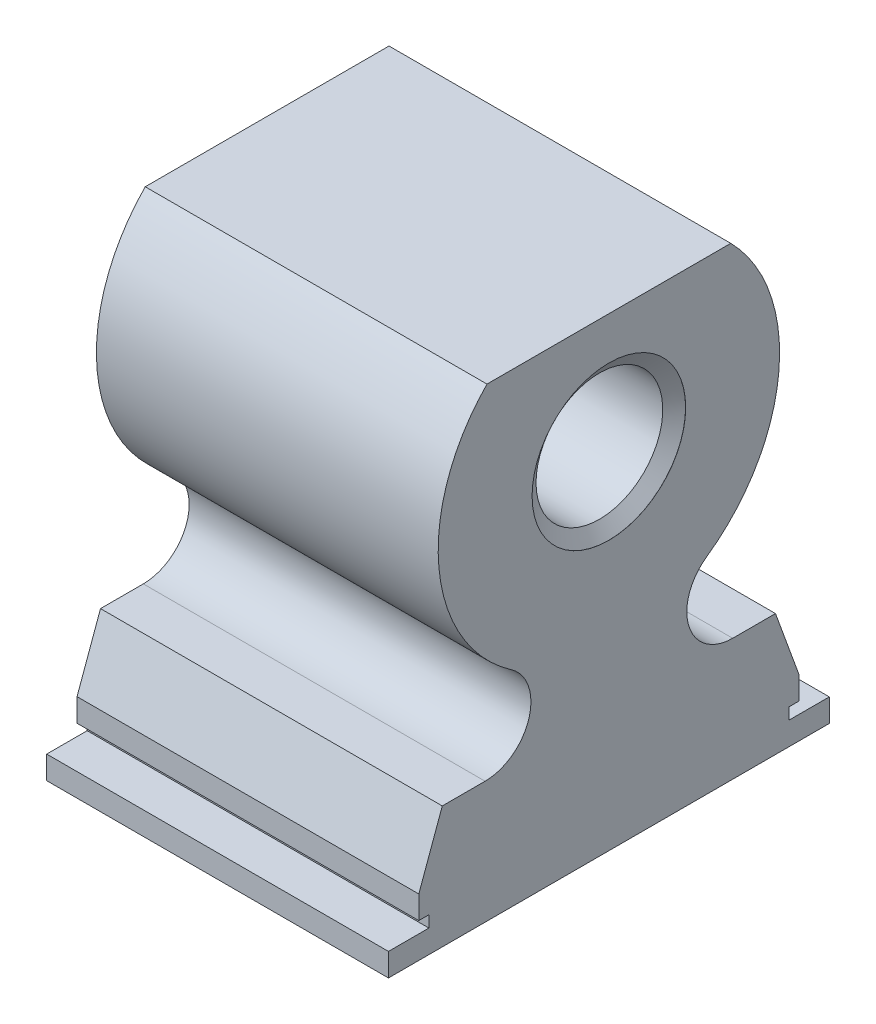
ISO-10303-21;
HEADER;
FILE_DESCRIPTION(('STEP AP214'),'2;1');
FILE_NAME('part.step','',(''),(''),'','','');
FILE_SCHEMA(('AUTOMOTIVE_DESIGN { 1 0 10303 214 1 1 1 1 }'));
ENDSEC;
DATA;
#1=APPLICATION_CONTEXT('core data for automotive mechanical design processes');
#2=APPLICATION_PROTOCOL_DEFINITION('international standard','automotive_design',2000,#1);
#3=PRODUCT_CONTEXT('',#1,'mechanical');
#4=PRODUCT('Part','Part','',(#3));
#5=PRODUCT_RELATED_PRODUCT_CATEGORY('part','',(#4));
#6=PRODUCT_DEFINITION_FORMATION('','',#4);
#7=PRODUCT_DEFINITION_CONTEXT('part definition',#1,'design');
#8=PRODUCT_DEFINITION('design','',#6,#7);
#9=PRODUCT_DEFINITION_SHAPE('','',#8);
#10=(LENGTH_UNIT() NAMED_UNIT(*) SI_UNIT(.MILLI.,.METRE.));
#11=(NAMED_UNIT(*) PLANE_ANGLE_UNIT() SI_UNIT($,.RADIAN.));
#12=(NAMED_UNIT(*) SI_UNIT($,.STERADIAN.) SOLID_ANGLE_UNIT());
#13=UNCERTAINTY_MEASURE_WITH_UNIT(LENGTH_MEASURE(1.E-05),#10,'distance_accuracy_value','');
#14=(GEOMETRIC_REPRESENTATION_CONTEXT(3) GLOBAL_UNCERTAINTY_ASSIGNED_CONTEXT((#13)) GLOBAL_UNIT_ASSIGNED_CONTEXT((#10,
#11,#12)) REPRESENTATION_CONTEXT('',''));
#15=CARTESIAN_POINT('',(0.,0.,0.));
#16=DIRECTION('',(0.,0.,1.));
#17=DIRECTION('',(1.,0.,0.));
#18=AXIS2_PLACEMENT_3D('',#15,#16,#17);
#19=CARTESIAN_POINT('',(8.9,0.,0.));
#20=DIRECTION('',(-1.,0.,0.));
#21=DIRECTION('',(0.,0.,1.));
#22=AXIS2_PLACEMENT_3D('',#19,#20,#21);
#23=CYLINDRICAL_SURFACE('',#22,4.445);
#24=CARTESIAN_POINT('',(8.9,0.,0.));
#25=DIRECTION('',(1.,0.,0.));
#26=DIRECTION('',(0.,0.,-1.));
#27=AXIS2_PLACEMENT_3D('',#24,#25,#26);
#28=CIRCLE('',#27,4.445);
#29=CARTESIAN_POINT('',(8.9,3.1115,3.1743649364873));
#30=VERTEX_POINT('',#29);
#31=CARTESIAN_POINT('',(8.9,-3.64692729897422,2.5412489598614));
#32=VERTEX_POINT('',#31);
#33=EDGE_CURVE('E306',#30,#32,#28,.T.);
#34=ORIENTED_EDGE('',*,*,#33,.F.);
#35=DIRECTION('',(-1.,0.,0.));
#36=VECTOR('',#35,1.);
#37=CARTESIAN_POINT('',(8.9,3.1115,3.1743649364873));
#38=LINE('',#37,#36);
#39=CARTESIAN_POINT('',(0.,3.1115,3.1743649364873));
#40=VERTEX_POINT('',#39);
#41=EDGE_CURVE('E11',#30,#40,#38,.T.);
#42=ORIENTED_EDGE('',*,*,#41,.T.);
#43=CARTESIAN_POINT('',(0.,0.,0.));
#44=DIRECTION('',(1.,0.,0.));
#45=DIRECTION('',(0.,0.,-1.));
#46=AXIS2_PLACEMENT_3D('',#43,#44,#45);
#47=CIRCLE('',#46,4.445);
#48=CARTESIAN_POINT('',(0.,-3.64692729897422,2.5412489598614));
#49=VERTEX_POINT('',#48);
#50=EDGE_CURVE('E225',#40,#49,#47,.T.);
#51=ORIENTED_EDGE('',*,*,#50,.T.);
#52=DIRECTION('',(-1.,0.,0.));
#53=VECTOR('',#52,1.);
#54=CARTESIAN_POINT('',(8.9,-3.64692729897422,2.5412489598614));
#55=LINE('',#54,#53);
#56=EDGE_CURVE('E254',#32,#49,#55,.T.);
#57=ORIENTED_EDGE('',*,*,#56,.F.);
#58=EDGE_LOOP('',(#34,#42,#51,#57));
#59=FACE_BOUND('',#58,.T.);
#60=ADVANCED_FACE('F32',(#59),#23,.T.);
#61=CARTESIAN_POINT('',(8.9,0.,0.));
#62=DIRECTION('',(-1.,0.,0.));
#63=DIRECTION('',(0.,0.,1.));
#64=AXIS2_PLACEMENT_3D('',#61,#62,#63);
#65=CYLINDRICAL_SURFACE('',#64,1.65);
#66=CARTESIAN_POINT('',(0.247521612824611,0.,0.));
#67=DIRECTION('',(-1.,0.,0.));
#68=DIRECTION('',(0.,0.,1.));
#69=AXIS2_PLACEMENT_3D('',#66,#67,#68);
#70=CIRCLE('',#69,1.65);
#71=CARTESIAN_POINT('',(0.247521612824611,0.,1.65));
#72=VERTEX_POINT('',#71);
#73=EDGE_CURVE('E288',#72,#72,#70,.T.);
#74=ORIENTED_EDGE('',*,*,#73,.T.);
#75=EDGE_LOOP('',(#74));
#76=FACE_BOUND('',#75,.T.);
#77=CARTESIAN_POINT('',(8.65247838717539,0.,0.));
#78=DIRECTION('',(-1.,0.,0.));
#79=DIRECTION('',(0.,0.,1.));
#80=AXIS2_PLACEMENT_3D('',#77,#78,#79);
#81=CIRCLE('',#80,1.65);
#82=CARTESIAN_POINT('',(8.65247838717539,0.,1.65));
#83=VERTEX_POINT('',#82);
#84=EDGE_CURVE('E366',#83,#83,#81,.T.);
#85=ORIENTED_EDGE('',*,*,#84,.F.);
#86=EDGE_LOOP('',(#85));
#87=FACE_BOUND('',#86,.T.);
#88=ADVANCED_FACE('F378',(#76,#87),#65,.F.);
#89=CARTESIAN_POINT('',(8.9,-4.62630314643533,3.22369685356467));
#90=DIRECTION('',(-1.,0.,0.));
#91=DIRECTION('',(0.,0.,1.));
#92=AXIS2_PLACEMENT_3D('',#89,#90,#91);
#93=PLANE('',#92);
#94=CARTESIAN_POINT('',(8.9,-3.64692729897422,-2.5412489598614));
#95=VERTEX_POINT('',#94);
#96=CARTESIAN_POINT('',(8.9,3.1115,-3.1743649364873));
#97=VERTEX_POINT('',#96);
#98=EDGE_CURVE('E296',#95,#97,#28,.T.);
#99=ORIENTED_EDGE('',*,*,#98,.T.);
#100=DIRECTION('',(0.,0.,1.));
#101=VECTOR('',#100,1.);
#102=CARTESIAN_POINT('',(8.9,3.1115,-4.445));
#103=LINE('',#102,#101);
#104=EDGE_CURVE('E47',#97,#30,#103,.T.);
#105=ORIENTED_EDGE('',*,*,#104,.T.);
#106=ORIENTED_EDGE('',*,*,#33,.T.);
#107=CARTESIAN_POINT('',(8.9,-4.62630314643533,3.22369685356467));
#108=DIRECTION('',(-1.,0.,0.));
#109=DIRECTION('',(0.,0.,1.));
#110=AXIS2_PLACEMENT_3D('',#107,#108,#109);
#111=CIRCLE('',#110,1.19369685356467);
#112=CARTESIAN_POINT('',(8.9,-5.82,3.22369685356467));
#113=VERTEX_POINT('',#112);
#114=EDGE_CURVE('E305',#32,#113,#111,.T.);
#115=ORIENTED_EDGE('',*,*,#114,.T.);
#116=DIRECTION('',(0.,0.,1.));
#117=VECTOR('',#116,1.);
#118=CARTESIAN_POINT('',(8.9,-5.82,3.22369685356467));
#119=LINE('',#118,#117);
#120=CARTESIAN_POINT('',(8.9,-5.82,4.33853000643278));
#121=VERTEX_POINT('',#120);
#122=EDGE_CURVE('E308',#113,#121,#119,.T.);
#123=ORIENTED_EDGE('',*,*,#122,.T.);
#124=DIRECTION('',(0.,-0.939692620785908,0.342020143325669));
#125=VECTOR('',#124,1.);
#126=CARTESIAN_POINT('',(8.9,-5.82,4.33853000643278));
#127=LINE('',#126,#125);
#128=CARTESIAN_POINT('',(8.9,-7.5,4.95));
#129=VERTEX_POINT('',#128);
#130=EDGE_CURVE('E314',#121,#129,#127,.T.);
#131=ORIENTED_EDGE('',*,*,#130,.T.);
#132=DIRECTION('',(0.,-1.,0.));
#133=VECTOR('',#132,1.);
#134=CARTESIAN_POINT('',(8.9,-7.5,4.95));
#135=LINE('',#134,#133);
#136=CARTESIAN_POINT('',(8.9,-8.1,4.95));
#137=VERTEX_POINT('',#136);
#138=EDGE_CURVE('E182',#129,#137,#135,.T.);
#139=ORIENTED_EDGE('',*,*,#138,.T.);
#140=DIRECTION('',(0.,0.,-1.));
#141=VECTOR('',#140,1.);
#142=CARTESIAN_POINT('',(8.9,-8.1,4.68666666666667));
#143=LINE('',#142,#141);
#144=CARTESIAN_POINT('',(8.9,-8.1,4.68666666666667));
#145=VERTEX_POINT('',#144);
#146=EDGE_CURVE('E173',#137,#145,#143,.T.);
#147=ORIENTED_EDGE('',*,*,#146,.T.);
#148=DIRECTION('',(0.,-1.,0.));
#149=VECTOR('',#148,1.);
#150=CARTESIAN_POINT('',(8.9,-8.4,4.68666666666667));
#151=LINE('',#150,#149);
#152=CARTESIAN_POINT('',(8.9,-8.4,4.68666666666667));
#153=VERTEX_POINT('',#152);
#154=EDGE_CURVE('E179',#145,#153,#151,.T.);
#155=ORIENTED_EDGE('',*,*,#154,.T.);
#156=DIRECTION('',(0.,0.,1.));
#157=VECTOR('',#156,1.);
#158=CARTESIAN_POINT('',(8.9,-8.4,5.74));
#159=LINE('',#158,#157);
#160=CARTESIAN_POINT('',(8.9,-8.4,5.74));
#161=VERTEX_POINT('',#160);
#162=EDGE_CURVE('E56',#153,#161,#159,.T.);
#163=ORIENTED_EDGE('',*,*,#162,.T.);
#164=DIRECTION('',(0.,-1.,0.));
#165=VECTOR('',#164,1.);
#166=CARTESIAN_POINT('',(8.9,-9.,5.74));
#167=LINE('',#166,#165);
#168=CARTESIAN_POINT('',(8.9,-9.,5.74));
#169=VERTEX_POINT('',#168);
#170=EDGE_CURVE('E241',#161,#169,#167,.T.);
#171=ORIENTED_EDGE('',*,*,#170,.T.);
#172=DIRECTION('',(0.,0.,-1.));
#173=VECTOR('',#172,1.);
#174=CARTESIAN_POINT('',(8.9,-9.,5.74));
#175=LINE('',#174,#173);
#176=CARTESIAN_POINT('',(8.9,-9.,-5.74));
#177=VERTEX_POINT('',#176);
#178=EDGE_CURVE('E128',#169,#177,#175,.T.);
#179=ORIENTED_EDGE('',*,*,#178,.T.);
#180=DIRECTION('',(0.,1.,0.));
#181=VECTOR('',#180,1.);
#182=CARTESIAN_POINT('',(8.9,-9.,-5.74));
#183=LINE('',#182,#181);
#184=CARTESIAN_POINT('',(8.9,-8.4,-5.74));
#185=VERTEX_POINT('',#184);
#186=EDGE_CURVE('E334',#177,#185,#183,.T.);
#187=ORIENTED_EDGE('',*,*,#186,.T.);
#188=DIRECTION('',(0.,0.,1.));
#189=VECTOR('',#188,1.);
#190=CARTESIAN_POINT('',(8.9,-8.4,-5.74));
#191=LINE('',#190,#189);
#192=CARTESIAN_POINT('',(8.9,-8.4,-4.68666666666667));
#193=VERTEX_POINT('',#192);
#194=EDGE_CURVE('E340',#185,#193,#191,.T.);
#195=ORIENTED_EDGE('',*,*,#194,.T.);
#196=DIRECTION('',(0.,1.,0.));
#197=VECTOR('',#196,1.);
#198=CARTESIAN_POINT('',(8.9,-8.4,-4.68666666666667));
#199=LINE('',#198,#197);
#200=CARTESIAN_POINT('',(8.9,-8.1,-4.68666666666667));
#201=VERTEX_POINT('',#200);
#202=EDGE_CURVE('E342',#193,#201,#199,.T.);
#203=ORIENTED_EDGE('',*,*,#202,.T.);
#204=DIRECTION('',(0.,0.,-1.));
#205=VECTOR('',#204,1.);
#206=CARTESIAN_POINT('',(8.9,-8.1,-4.68666666666667));
#207=LINE('',#206,#205);
#208=CARTESIAN_POINT('',(8.9,-8.1,-4.95));
#209=VERTEX_POINT('',#208);
#210=EDGE_CURVE('E344',#201,#209,#207,.T.);
#211=ORIENTED_EDGE('',*,*,#210,.T.);
#212=DIRECTION('',(0.,1.,0.));
#213=VECTOR('',#212,1.);
#214=CARTESIAN_POINT('',(8.9,-7.5,-4.95));
#215=LINE('',#214,#213);
#216=CARTESIAN_POINT('',(8.9,-7.5,-4.95));
#217=VERTEX_POINT('',#216);
#218=EDGE_CURVE('E346',#209,#217,#215,.T.);
#219=ORIENTED_EDGE('',*,*,#218,.T.);
#220=DIRECTION('',(0.,0.939692620785908,0.342020143325669));
#221=VECTOR('',#220,1.);
#222=CARTESIAN_POINT('',(8.9,-5.82,-4.33853000643278));
#223=LINE('',#222,#221);
#224=CARTESIAN_POINT('',(8.9,-5.82,-4.33853000643278));
#225=VERTEX_POINT('',#224);
#226=EDGE_CURVE('E348',#217,#225,#223,.T.);
#227=ORIENTED_EDGE('',*,*,#226,.T.);
#228=DIRECTION('',(0.,0.,1.));
#229=VECTOR('',#228,1.);
#230=CARTESIAN_POINT('',(8.9,-5.82,-4.33853000643278));
#231=LINE('',#230,#229);
#232=CARTESIAN_POINT('',(8.9,-5.82,-3.22369685356467));
#233=VERTEX_POINT('',#232);
#234=EDGE_CURVE('E349',#225,#233,#231,.T.);
#235=ORIENTED_EDGE('',*,*,#234,.T.);
#236=CARTESIAN_POINT('',(8.9,-4.62630314643533,-3.22369685356467));
#237=DIRECTION('',(-1.,0.,0.));
#238=DIRECTION('',(0.,0.,1.));
#239=AXIS2_PLACEMENT_3D('',#236,#237,#238);
#240=CIRCLE('',#239,1.19369685356467);
#241=EDGE_CURVE('E303',#233,#95,#240,.T.);
#242=ORIENTED_EDGE('',*,*,#241,.T.);
#243=EDGE_LOOP('',(#99,#105,#106,#115,#123,#131,#139,#147,#155,#163,#171,#179,#187,#195,#203,
#211,#219,#227,#235,#242));
#244=FACE_BOUND('',#243,.T.);
#245=CARTESIAN_POINT('',(8.9,0.,0.));
#246=DIRECTION('',(-1.,0.,0.));
#247=DIRECTION('',(0.,0.,1.));
#248=AXIS2_PLACEMENT_3D('',#245,#246,#247);
#249=CIRCLE('',#248,2.);
#250=CARTESIAN_POINT('',(8.9,0.,2.));
#251=VERTEX_POINT('',#250);
#252=EDGE_CURVE('E289',#251,#251,#249,.F.);
#253=ORIENTED_EDGE('',*,*,#252,.F.);
#254=EDGE_LOOP('',(#253));
#255=FACE_BOUND('',#254,.T.);
#256=ADVANCED_FACE('F176',(#244,#255),#93,.F.);
#257=CARTESIAN_POINT('',(0.,-4.62630314643533,3.22369685356467));
#258=DIRECTION('',(-1.,0.,0.));
#259=DIRECTION('',(0.,0.,1.));
#260=AXIS2_PLACEMENT_3D('',#257,#258,#259);
#261=PLANE('',#260);
#262=DIRECTION('',(0.,0.,1.));
#263=VECTOR('',#262,1.);
#264=CARTESIAN_POINT('',(0.,3.1115,-4.445));
#265=LINE('',#264,#263);
#266=CARTESIAN_POINT('',(0.,3.1115,-3.1743649364873));
#267=VERTEX_POINT('',#266);
#268=EDGE_CURVE('E361',#267,#40,#265,.T.);
#269=ORIENTED_EDGE('',*,*,#268,.F.);
#270=CARTESIAN_POINT('',(0.,-3.64692729897422,-2.5412489598614));
#271=VERTEX_POINT('',#270);
#272=EDGE_CURVE('E226',#271,#267,#47,.T.);
#273=ORIENTED_EDGE('',*,*,#272,.F.);
#274=CARTESIAN_POINT('',(0.,-4.62630314643533,-3.22369685356467));
#275=DIRECTION('',(-1.,0.,0.));
#276=DIRECTION('',(0.,0.,1.));
#277=AXIS2_PLACEMENT_3D('',#274,#275,#276);
#278=CIRCLE('',#277,1.19369685356467);
#279=CARTESIAN_POINT('',(0.,-5.82,-3.22369685356467));
#280=VERTEX_POINT('',#279);
#281=EDGE_CURVE('E223',#280,#271,#278,.T.);
#282=ORIENTED_EDGE('',*,*,#281,.F.);
#283=DIRECTION('',(0.,0.,1.));
#284=VECTOR('',#283,1.);
#285=CARTESIAN_POINT('',(0.,-5.82,-4.33853000643278));
#286=LINE('',#285,#284);
#287=CARTESIAN_POINT('',(0.,-5.82,-4.33853000643278));
#288=VERTEX_POINT('',#287);
#289=EDGE_CURVE('E221',#288,#280,#286,.T.);
#290=ORIENTED_EDGE('',*,*,#289,.F.);
#291=DIRECTION('',(0.,0.939692620785908,0.342020143325669));
#292=VECTOR('',#291,1.);
#293=CARTESIAN_POINT('',(0.,-5.82,-4.33853000643278));
#294=LINE('',#293,#292);
#295=CARTESIAN_POINT('',(0.,-7.5,-4.95));
#296=VERTEX_POINT('',#295);
#297=EDGE_CURVE('E219',#296,#288,#294,.T.);
#298=ORIENTED_EDGE('',*,*,#297,.F.);
#299=DIRECTION('',(0.,1.,0.));
#300=VECTOR('',#299,1.);
#301=CARTESIAN_POINT('',(0.,-7.5,-4.95));
#302=LINE('',#301,#300);
#303=CARTESIAN_POINT('',(0.,-8.1,-4.95));
#304=VERTEX_POINT('',#303);
#305=EDGE_CURVE('E217',#304,#296,#302,.T.);
#306=ORIENTED_EDGE('',*,*,#305,.F.);
#307=DIRECTION('',(0.,0.,-1.));
#308=VECTOR('',#307,1.);
#309=CARTESIAN_POINT('',(0.,-8.1,-4.68666666666667));
#310=LINE('',#309,#308);
#311=CARTESIAN_POINT('',(0.,-8.1,-4.68666666666667));
#312=VERTEX_POINT('',#311);
#313=EDGE_CURVE('E215',#312,#304,#310,.T.);
#314=ORIENTED_EDGE('',*,*,#313,.F.);
#315=DIRECTION('',(0.,1.,0.));
#316=VECTOR('',#315,1.);
#317=CARTESIAN_POINT('',(0.,-8.4,-4.68666666666667));
#318=LINE('',#317,#316);
#319=CARTESIAN_POINT('',(0.,-8.4,-4.68666666666667));
#320=VERTEX_POINT('',#319);
#321=EDGE_CURVE('E213',#320,#312,#318,.T.);
#322=ORIENTED_EDGE('',*,*,#321,.F.);
#323=DIRECTION('',(0.,0.,1.));
#324=VECTOR('',#323,1.);
#325=CARTESIAN_POINT('',(0.,-8.4,-5.74));
#326=LINE('',#325,#324);
#327=CARTESIAN_POINT('',(0.,-8.4,-5.74));
#328=VERTEX_POINT('',#327);
#329=EDGE_CURVE('E211',#328,#320,#326,.T.);
#330=ORIENTED_EDGE('',*,*,#329,.F.);
#331=DIRECTION('',(0.,1.,0.));
#332=VECTOR('',#331,1.);
#333=CARTESIAN_POINT('',(0.,-9.,-5.74));
#334=LINE('',#333,#332);
#335=CARTESIAN_POINT('',(0.,-9.,-5.74));
#336=VERTEX_POINT('',#335);
#337=EDGE_CURVE('E209',#336,#328,#334,.T.);
#338=ORIENTED_EDGE('',*,*,#337,.F.);
#339=DIRECTION('',(0.,0.,-1.));
#340=VECTOR('',#339,1.);
#341=CARTESIAN_POINT('',(0.,-9.,5.74));
#342=LINE('',#341,#340);
#343=CARTESIAN_POINT('',(0.,-9.,5.74));
#344=VERTEX_POINT('',#343);
#345=EDGE_CURVE('E206',#344,#336,#342,.T.);
#346=ORIENTED_EDGE('',*,*,#345,.F.);
#347=DIRECTION('',(0.,-1.,0.));
#348=VECTOR('',#347,1.);
#349=CARTESIAN_POINT('',(0.,-9.,5.74));
#350=LINE('',#349,#348);
#351=CARTESIAN_POINT('',(0.,-8.4,5.74));
#352=VERTEX_POINT('',#351);
#353=EDGE_CURVE('E203',#352,#344,#350,.T.);
#354=ORIENTED_EDGE('',*,*,#353,.F.);
#355=DIRECTION('',(0.,0.,1.));
#356=VECTOR('',#355,1.);
#357=CARTESIAN_POINT('',(0.,-8.4,5.74));
#358=LINE('',#357,#356);
#359=CARTESIAN_POINT('',(0.,-8.4,4.68666666666667));
#360=VERTEX_POINT('',#359);
#361=EDGE_CURVE('E119',#360,#352,#358,.T.);
#362=ORIENTED_EDGE('',*,*,#361,.F.);
#363=DIRECTION('',(0.,-1.,0.));
#364=VECTOR('',#363,1.);
#365=CARTESIAN_POINT('',(0.,-8.4,4.68666666666667));
#366=LINE('',#365,#364);
#367=CARTESIAN_POINT('',(0.,-8.1,4.68666666666667));
#368=VERTEX_POINT('',#367);
#369=EDGE_CURVE('E238',#368,#360,#366,.T.);
#370=ORIENTED_EDGE('',*,*,#369,.F.);
#371=DIRECTION('',(0.,0.,-1.));
#372=VECTOR('',#371,1.);
#373=CARTESIAN_POINT('',(0.,-8.1,4.68666666666667));
#374=LINE('',#373,#372);
#375=CARTESIAN_POINT('',(0.,-8.1,4.95));
#376=VERTEX_POINT('',#375);
#377=EDGE_CURVE('E191',#376,#368,#374,.T.);
#378=ORIENTED_EDGE('',*,*,#377,.F.);
#379=DIRECTION('',(0.,-1.,0.));
#380=VECTOR('',#379,1.);
#381=CARTESIAN_POINT('',(0.,-7.5,4.95));
#382=LINE('',#381,#380);
#383=CARTESIAN_POINT('',(0.,-7.5,4.95));
#384=VERTEX_POINT('',#383);
#385=EDGE_CURVE('E235',#384,#376,#382,.T.);
#386=ORIENTED_EDGE('',*,*,#385,.F.);
#387=DIRECTION('',(0.,-0.939692620785908,0.342020143325669));
#388=VECTOR('',#387,1.);
#389=CARTESIAN_POINT('',(0.,-5.82,4.33853000643278));
#390=LINE('',#389,#388);
#391=CARTESIAN_POINT('',(0.,-5.82,4.33853000643278));
#392=VERTEX_POINT('',#391);
#393=EDGE_CURVE('E233',#392,#384,#390,.T.);
#394=ORIENTED_EDGE('',*,*,#393,.F.);
#395=DIRECTION('',(0.,0.,1.));
#396=VECTOR('',#395,1.);
#397=CARTESIAN_POINT('',(0.,-5.82,3.22369685356467));
#398=LINE('',#397,#396);
#399=CARTESIAN_POINT('',(0.,-5.82,3.22369685356467));
#400=VERTEX_POINT('',#399);
#401=EDGE_CURVE('E231',#400,#392,#398,.T.);
#402=ORIENTED_EDGE('',*,*,#401,.F.);
#403=CARTESIAN_POINT('',(0.,-4.62630314643533,3.22369685356467));
#404=DIRECTION('',(-1.,0.,0.));
#405=DIRECTION('',(0.,0.,1.));
#406=AXIS2_PLACEMENT_3D('',#403,#404,#405);
#407=CIRCLE('',#406,1.19369685356467);
#408=EDGE_CURVE('E229',#49,#400,#407,.T.);
#409=ORIENTED_EDGE('',*,*,#408,.F.);
#410=ORIENTED_EDGE('',*,*,#50,.F.);
#411=EDGE_LOOP('',(#269,#273,#282,#290,#298,#306,#314,#322,#330,#338,#346,#354,#362,#370,#378,
#386,#394,#402,#409,#410));
#412=FACE_BOUND('',#411,.T.);
#413=CARTESIAN_POINT('',(0.,0.,0.));
#414=DIRECTION('',(-1.,0.,0.));
#415=DIRECTION('',(0.,0.,1.));
#416=AXIS2_PLACEMENT_3D('',#413,#414,#415);
#417=CIRCLE('',#416,2.);
#418=CARTESIAN_POINT('',(0.,0.,2.));
#419=VERTEX_POINT('',#418);
#420=EDGE_CURVE('E207',#419,#419,#417,.F.);
#421=ORIENTED_EDGE('',*,*,#420,.T.);
#422=EDGE_LOOP('',(#421));
#423=FACE_BOUND('',#422,.T.);
#424=ADVANCED_FACE('F326',(#412,#423),#261,.T.);
#425=CARTESIAN_POINT('',(8.9,-9.,5.74));
#426=DIRECTION('',(0.,0.,-1.));
#427=DIRECTION('',(0.,1.,0.));
#428=AXIS2_PLACEMENT_3D('',#425,#426,#427);
#429=PLANE('',#428);
#430=ORIENTED_EDGE('',*,*,#353,.T.);
#431=DIRECTION('',(-1.,0.,0.));
#432=VECTOR('',#431,1.);
#433=CARTESIAN_POINT('',(8.9,-9.,5.74));
#434=LINE('',#433,#432);
#435=EDGE_CURVE('E284',#169,#344,#434,.T.);
#436=ORIENTED_EDGE('',*,*,#435,.F.);
#437=ORIENTED_EDGE('',*,*,#170,.F.);
#438=DIRECTION('',(-1.,0.,0.));
#439=VECTOR('',#438,1.);
#440=CARTESIAN_POINT('',(8.9,-8.4,5.74));
#441=LINE('',#440,#439);
#442=EDGE_CURVE('E199',#161,#352,#441,.T.);
#443=ORIENTED_EDGE('',*,*,#442,.T.);
#444=EDGE_LOOP('',(#430,#436,#437,#443));
#445=FACE_BOUND('',#444,.T.);
#446=ADVANCED_FACE('F34',(#445),#429,.F.);
#447=CARTESIAN_POINT('',(8.9,-9.,5.74));
#448=DIRECTION('',(0.,1.,0.));
#449=DIRECTION('',(0.,0.,1.));
#450=AXIS2_PLACEMENT_3D('',#447,#448,#449);
#451=PLANE('',#450);
#452=ORIENTED_EDGE('',*,*,#345,.T.);
#453=DIRECTION('',(-1.,0.,0.));
#454=VECTOR('',#453,1.);
#455=CARTESIAN_POINT('',(8.9,-9.,-5.74));
#456=LINE('',#455,#454);
#457=EDGE_CURVE('E281',#177,#336,#456,.T.);
#458=ORIENTED_EDGE('',*,*,#457,.F.);
#459=ORIENTED_EDGE('',*,*,#178,.F.);
#460=ORIENTED_EDGE('',*,*,#435,.T.);
#461=EDGE_LOOP('',(#452,#458,#459,#460));
#462=FACE_BOUND('',#461,.T.);
#463=ADVANCED_FACE('F437',(#462),#451,.F.);
#464=CARTESIAN_POINT('',(8.9,-9.,-5.74));
#465=DIRECTION('',(0.,0.,1.));
#466=DIRECTION('',(0.,-1.,0.));
#467=AXIS2_PLACEMENT_3D('',#464,#465,#466);
#468=PLANE('',#467);
#469=ORIENTED_EDGE('',*,*,#337,.T.);
#470=DIRECTION('',(-1.,0.,0.));
#471=VECTOR('',#470,1.);
#472=CARTESIAN_POINT('',(8.9,-8.4,-5.74));
#473=LINE('',#472,#471);
#474=EDGE_CURVE('E278',#185,#328,#473,.T.);
#475=ORIENTED_EDGE('',*,*,#474,.F.);
#476=ORIENTED_EDGE('',*,*,#186,.F.);
#477=ORIENTED_EDGE('',*,*,#457,.T.);
#478=EDGE_LOOP('',(#469,#475,#476,#477));
#479=FACE_BOUND('',#478,.T.);
#480=ADVANCED_FACE('F434',(#479),#468,.F.);
#481=CARTESIAN_POINT('',(8.9,-8.4,-5.74));
#482=DIRECTION('',(0.,-1.,0.));
#483=DIRECTION('',(0.,0.,-1.));
#484=AXIS2_PLACEMENT_3D('',#481,#482,#483);
#485=PLANE('',#484);
#486=ORIENTED_EDGE('',*,*,#329,.T.);
#487=DIRECTION('',(-1.,0.,0.));
#488=VECTOR('',#487,1.);
#489=CARTESIAN_POINT('',(8.9,-8.4,-4.68666666666667));
#490=LINE('',#489,#488);
#491=EDGE_CURVE('E275',#193,#320,#490,.T.);
#492=ORIENTED_EDGE('',*,*,#491,.F.);
#493=ORIENTED_EDGE('',*,*,#194,.F.);
#494=ORIENTED_EDGE('',*,*,#474,.T.);
#495=EDGE_LOOP('',(#486,#492,#493,#494));
#496=FACE_BOUND('',#495,.T.);
#497=ADVANCED_FACE('F430',(#496),#485,.F.);
#498=CARTESIAN_POINT('',(8.9,-8.4,-4.68666666666667));
#499=DIRECTION('',(0.,0.,1.));
#500=DIRECTION('',(0.,-1.,0.));
#501=AXIS2_PLACEMENT_3D('',#498,#499,#500);
#502=PLANE('',#501);
#503=ORIENTED_EDGE('',*,*,#321,.T.);
#504=DIRECTION('',(-1.,0.,0.));
#505=VECTOR('',#504,1.);
#506=CARTESIAN_POINT('',(8.9,-8.1,-4.68666666666667));
#507=LINE('',#506,#505);
#508=EDGE_CURVE('E272',#201,#312,#507,.T.);
#509=ORIENTED_EDGE('',*,*,#508,.F.);
#510=ORIENTED_EDGE('',*,*,#202,.F.);
#511=ORIENTED_EDGE('',*,*,#491,.T.);
#512=EDGE_LOOP('',(#503,#509,#510,#511));
#513=FACE_BOUND('',#512,.T.);
#514=ADVANCED_FACE('F426',(#513),#502,.F.);
#515=CARTESIAN_POINT('',(8.9,-8.1,-4.68666666666667));
#516=DIRECTION('',(0.,1.,0.));
#517=DIRECTION('',(0.,0.,1.));
#518=AXIS2_PLACEMENT_3D('',#515,#516,#517);
#519=PLANE('',#518);
#520=ORIENTED_EDGE('',*,*,#313,.T.);
#521=DIRECTION('',(-1.,0.,0.));
#522=VECTOR('',#521,1.);
#523=CARTESIAN_POINT('',(8.9,-8.1,-4.95));
#524=LINE('',#523,#522);
#525=EDGE_CURVE('E269',#209,#304,#524,.T.);
#526=ORIENTED_EDGE('',*,*,#525,.F.);
#527=ORIENTED_EDGE('',*,*,#210,.F.);
#528=ORIENTED_EDGE('',*,*,#508,.T.);
#529=EDGE_LOOP('',(#520,#526,#527,#528));
#530=FACE_BOUND('',#529,.T.);
#531=ADVANCED_FACE('F422',(#530),#519,.F.);
#532=CARTESIAN_POINT('',(8.9,-7.5,-4.95));
#533=DIRECTION('',(0.,0.,1.));
#534=DIRECTION('',(1.,0.,0.));
#535=AXIS2_PLACEMENT_3D('',#532,#533,#534);
#536=PLANE('',#535);
#537=ORIENTED_EDGE('',*,*,#305,.T.);
#538=DIRECTION('',(-1.,0.,0.));
#539=VECTOR('',#538,1.);
#540=CARTESIAN_POINT('',(8.9,-7.5,-4.95));
#541=LINE('',#540,#539);
#542=EDGE_CURVE('E266',#217,#296,#541,.T.);
#543=ORIENTED_EDGE('',*,*,#542,.F.);
#544=ORIENTED_EDGE('',*,*,#218,.F.);
#545=ORIENTED_EDGE('',*,*,#525,.T.);
#546=EDGE_LOOP('',(#537,#543,#544,#545));
#547=FACE_BOUND('',#546,.T.);
#548=ADVANCED_FACE('F418',(#547),#536,.F.);
#549=CARTESIAN_POINT('',(8.9,-5.82,-4.33853000643278));
#550=DIRECTION('',(0.,-0.342020143325669,0.939692620785908));
#551=DIRECTION('',(0.,-0.939692620785908,-0.342020143325669));
#552=AXIS2_PLACEMENT_3D('',#549,#550,#551);
#553=PLANE('',#552);
#554=ORIENTED_EDGE('',*,*,#297,.T.);
#555=DIRECTION('',(-1.,0.,0.));
#556=VECTOR('',#555,1.);
#557=CARTESIAN_POINT('',(8.9,-5.82,-4.33853000643278));
#558=LINE('',#557,#556);
#559=EDGE_CURVE('E263',#225,#288,#558,.T.);
#560=ORIENTED_EDGE('',*,*,#559,.F.);
#561=ORIENTED_EDGE('',*,*,#226,.F.);
#562=ORIENTED_EDGE('',*,*,#542,.T.);
#563=EDGE_LOOP('',(#554,#560,#561,#562));
#564=FACE_BOUND('',#563,.T.);
#565=ADVANCED_FACE('F413',(#564),#553,.F.);
#566=CARTESIAN_POINT('',(8.9,-5.82,-4.33853000643278));
#567=DIRECTION('',(0.,-1.,0.));
#568=DIRECTION('',(0.,0.,-1.));
#569=AXIS2_PLACEMENT_3D('',#566,#567,#568);
#570=PLANE('',#569);
#571=ORIENTED_EDGE('',*,*,#289,.T.);
#572=DIRECTION('',(-1.,0.,0.));
#573=VECTOR('',#572,1.);
#574=CARTESIAN_POINT('',(8.9,-5.82,-3.22369685356467));
#575=LINE('',#574,#573);
#576=EDGE_CURVE('E260',#233,#280,#575,.T.);
#577=ORIENTED_EDGE('',*,*,#576,.F.);
#578=ORIENTED_EDGE('',*,*,#234,.F.);
#579=ORIENTED_EDGE('',*,*,#559,.T.);
#580=EDGE_LOOP('',(#571,#577,#578,#579));
#581=FACE_BOUND('',#580,.T.);
#582=ADVANCED_FACE('F355',(#581),#570,.F.);
#583=CARTESIAN_POINT('',(8.9,-4.62630314643533,-3.22369685356467));
#584=DIRECTION('',(-1.,0.,0.));
#585=DIRECTION('',(0.,0.,1.));
#586=AXIS2_PLACEMENT_3D('',#583,#584,#585);
#587=CYLINDRICAL_SURFACE('',#586,1.19369685356467);
#588=ORIENTED_EDGE('',*,*,#281,.T.);
#589=DIRECTION('',(-1.,0.,0.));
#590=VECTOR('',#589,1.);
#591=CARTESIAN_POINT('',(8.9,-3.64692729897422,-2.5412489598614));
#592=LINE('',#591,#590);
#593=EDGE_CURVE('E257',#95,#271,#592,.T.);
#594=ORIENTED_EDGE('',*,*,#593,.F.);
#595=ORIENTED_EDGE('',*,*,#241,.F.);
#596=ORIENTED_EDGE('',*,*,#576,.T.);
#597=EDGE_LOOP('',(#588,#594,#595,#596));
#598=FACE_BOUND('',#597,.T.);
#599=ADVANCED_FACE('F359',(#598),#587,.F.);
#600=ORIENTED_EDGE('',*,*,#272,.T.);
#601=DIRECTION('',(-1.,0.,0.));
#602=VECTOR('',#601,1.);
#603=CARTESIAN_POINT('',(8.9,3.1115,-3.1743649364873));
#604=LINE('',#603,#602);
#605=EDGE_CURVE('E40',#267,#97,#604,.F.);
#606=ORIENTED_EDGE('',*,*,#605,.T.);
#607=ORIENTED_EDGE('',*,*,#98,.F.);
#608=ORIENTED_EDGE('',*,*,#593,.T.);
#609=EDGE_LOOP('',(#600,#606,#607,#608));
#610=FACE_BOUND('',#609,.T.);
#611=ADVANCED_FACE('F295',(#610),#23,.T.);
#612=CARTESIAN_POINT('',(8.9,-4.62630314643533,3.22369685356467));
#613=DIRECTION('',(-1.,0.,0.));
#614=DIRECTION('',(0.,0.,1.));
#615=AXIS2_PLACEMENT_3D('',#612,#613,#614);
#616=CYLINDRICAL_SURFACE('',#615,1.19369685356467);
#617=ORIENTED_EDGE('',*,*,#408,.T.);
#618=DIRECTION('',(-1.,0.,0.));
#619=VECTOR('',#618,1.);
#620=CARTESIAN_POINT('',(8.9,-5.82,3.22369685356467));
#621=LINE('',#620,#619);
#622=EDGE_CURVE('E251',#113,#400,#621,.T.);
#623=ORIENTED_EDGE('',*,*,#622,.F.);
#624=ORIENTED_EDGE('',*,*,#114,.F.);
#625=ORIENTED_EDGE('',*,*,#56,.T.);
#626=EDGE_LOOP('',(#617,#623,#624,#625));
#627=FACE_BOUND('',#626,.T.);
#628=ADVANCED_FACE('F403',(#627),#616,.F.);
#629=CARTESIAN_POINT('',(8.9,-5.82,3.22369685356467));
#630=DIRECTION('',(0.,-1.,0.));
#631=DIRECTION('',(0.,0.,-1.));
#632=AXIS2_PLACEMENT_3D('',#629,#630,#631);
#633=PLANE('',#632);
#634=ORIENTED_EDGE('',*,*,#401,.T.);
#635=DIRECTION('',(-1.,0.,0.));
#636=VECTOR('',#635,1.);
#637=CARTESIAN_POINT('',(8.9,-5.82,4.33853000643278));
#638=LINE('',#637,#636);
#639=EDGE_CURVE('E248',#121,#392,#638,.T.);
#640=ORIENTED_EDGE('',*,*,#639,.F.);
#641=ORIENTED_EDGE('',*,*,#122,.F.);
#642=ORIENTED_EDGE('',*,*,#622,.T.);
#643=EDGE_LOOP('',(#634,#640,#641,#642));
#644=FACE_BOUND('',#643,.T.);
#645=ADVANCED_FACE('F408',(#644),#633,.F.);
#646=CARTESIAN_POINT('',(8.9,-5.82,4.33853000643278));
#647=DIRECTION('',(0.,-0.342020143325669,-0.939692620785908));
#648=DIRECTION('',(0.,0.939692620785908,-0.342020143325669));
#649=AXIS2_PLACEMENT_3D('',#646,#647,#648);
#650=PLANE('',#649);
#651=ORIENTED_EDGE('',*,*,#393,.T.);
#652=DIRECTION('',(-1.,0.,0.));
#653=VECTOR('',#652,1.);
#654=CARTESIAN_POINT('',(8.9,-7.5,4.95));
#655=LINE('',#654,#653);
#656=EDGE_CURVE('E245',#129,#384,#655,.T.);
#657=ORIENTED_EDGE('',*,*,#656,.F.);
#658=ORIENTED_EDGE('',*,*,#130,.F.);
#659=ORIENTED_EDGE('',*,*,#639,.T.);
#660=EDGE_LOOP('',(#651,#657,#658,#659));
#661=FACE_BOUND('',#660,.T.);
#662=ADVANCED_FACE('F320',(#661),#650,.F.);
#663=CARTESIAN_POINT('',(8.9,-7.5,4.95));
#664=DIRECTION('',(0.,0.,-1.));
#665=DIRECTION('',(-1.,0.,0.));
#666=AXIS2_PLACEMENT_3D('',#663,#664,#665);
#667=PLANE('',#666);
#668=ORIENTED_EDGE('',*,*,#385,.T.);
#669=DIRECTION('',(-1.,0.,0.));
#670=VECTOR('',#669,1.);
#671=CARTESIAN_POINT('',(8.9,-8.1,4.95));
#672=LINE('',#671,#670);
#673=EDGE_CURVE('E194',#137,#376,#672,.T.);
#674=ORIENTED_EDGE('',*,*,#673,.F.);
#675=ORIENTED_EDGE('',*,*,#138,.F.);
#676=ORIENTED_EDGE('',*,*,#656,.T.);
#677=EDGE_LOOP('',(#668,#674,#675,#676));
#678=FACE_BOUND('',#677,.T.);
#679=ADVANCED_FACE('F324',(#678),#667,.F.);
#680=CARTESIAN_POINT('',(8.9,-8.1,4.68666666666667));
#681=DIRECTION('',(0.,1.,0.));
#682=DIRECTION('',(0.,0.,1.));
#683=AXIS2_PLACEMENT_3D('',#680,#681,#682);
#684=PLANE('',#683);
#685=ORIENTED_EDGE('',*,*,#377,.T.);
#686=DIRECTION('',(-1.,0.,0.));
#687=VECTOR('',#686,1.);
#688=CARTESIAN_POINT('',(8.9,-8.1,4.68666666666667));
#689=LINE('',#688,#687);
#690=EDGE_CURVE('E188',#145,#368,#689,.T.);
#691=ORIENTED_EDGE('',*,*,#690,.F.);
#692=ORIENTED_EDGE('',*,*,#146,.F.);
#693=ORIENTED_EDGE('',*,*,#673,.T.);
#694=EDGE_LOOP('',(#685,#691,#692,#693));
#695=FACE_BOUND('',#694,.T.);
#696=ADVANCED_FACE('F189',(#695),#684,.F.);
#697=CARTESIAN_POINT('',(8.9,-8.4,4.68666666666667));
#698=DIRECTION('',(0.,0.,-1.));
#699=DIRECTION('',(0.,1.,0.));
#700=AXIS2_PLACEMENT_3D('',#697,#698,#699);
#701=PLANE('',#700);
#702=ORIENTED_EDGE('',*,*,#369,.T.);
#703=DIRECTION('',(-1.,0.,0.));
#704=VECTOR('',#703,1.);
#705=CARTESIAN_POINT('',(8.9,-8.4,4.68666666666667));
#706=LINE('',#705,#704);
#707=EDGE_CURVE('E195',#153,#360,#706,.T.);
#708=ORIENTED_EDGE('',*,*,#707,.F.);
#709=ORIENTED_EDGE('',*,*,#154,.F.);
#710=ORIENTED_EDGE('',*,*,#690,.T.);
#711=EDGE_LOOP('',(#702,#708,#709,#710));
#712=FACE_BOUND('',#711,.T.);
#713=ADVANCED_FACE('F197',(#712),#701,.F.);
#714=CARTESIAN_POINT('',(8.9,-8.4,5.74));
#715=DIRECTION('',(0.,-1.,0.));
#716=DIRECTION('',(0.,0.,-1.));
#717=AXIS2_PLACEMENT_3D('',#714,#715,#716);
#718=PLANE('',#717);
#719=ORIENTED_EDGE('',*,*,#361,.T.);
#720=ORIENTED_EDGE('',*,*,#442,.F.);
#721=ORIENTED_EDGE('',*,*,#162,.F.);
#722=ORIENTED_EDGE('',*,*,#707,.T.);
#723=EDGE_LOOP('',(#719,#720,#721,#722));
#724=FACE_BOUND('',#723,.T.);
#725=ADVANCED_FACE('F329',(#724),#718,.F.);
#726=CARTESIAN_POINT('',(0.247521612824611,0.,0.));
#727=DIRECTION('',(-1.,0.,0.));
#728=DIRECTION('',(0.,0.,1.));
#729=AXIS2_PLACEMENT_3D('',#726,#727,#728);
#730=CONICAL_SURFACE('',#729,1.65,0.960105621522087);
#731=CARTESIAN_POINT('',(0.00254000000000053,0.,0.));
#732=DIRECTION('',(-1.,0.,0.));
#733=DIRECTION('',(0.,0.,1.));
#734=AXIS2_PLACEMENT_3D('',#731,#732,#733);
#735=CIRCLE('',#734,2.);
#736=CARTESIAN_POINT('',(0.00254000000000053,0.,2.));
#737=VERTEX_POINT('',#736);
#738=EDGE_CURVE('E291',#737,#737,#735,.T.);
#739=ORIENTED_EDGE('',*,*,#738,.T.);
#740=EDGE_LOOP('',(#739));
#741=FACE_BOUND('',#740,.T.);
#742=ORIENTED_EDGE('',*,*,#73,.F.);
#743=EDGE_LOOP('',(#742));
#744=FACE_BOUND('',#743,.T.);
#745=ADVANCED_FACE('F381',(#741,#744),#730,.F.);
#746=CARTESIAN_POINT('',(-5.10587962441342,0.,0.));
#747=DIRECTION('',(-1.,0.,0.));
#748=DIRECTION('',(0.,0.,1.));
#749=AXIS2_PLACEMENT_3D('',#746,#747,#748);
#750=CYLINDRICAL_SURFACE('',#749,2.);
#751=ORIENTED_EDGE('',*,*,#420,.F.);
#752=EDGE_LOOP('',(#751));
#753=FACE_BOUND('',#752,.T.);
#754=ORIENTED_EDGE('',*,*,#738,.F.);
#755=EDGE_LOOP('',(#754));
#756=FACE_BOUND('',#755,.T.);
#757=ADVANCED_FACE('F383',(#753,#756),#750,.F.);
#758=CARTESIAN_POINT('',(-5.10587962441342,0.,0.));
#759=DIRECTION('',(-1.,0.,0.));
#760=DIRECTION('',(0.,0.,1.));
#761=AXIS2_PLACEMENT_3D('',#758,#759,#760);
#762=CYLINDRICAL_SURFACE('',#761,2.);
#763=CARTESIAN_POINT('',(8.89746,0.,0.));
#764=DIRECTION('',(-1.,0.,0.));
#765=DIRECTION('',(0.,0.,1.));
#766=AXIS2_PLACEMENT_3D('',#763,#764,#765);
#767=CIRCLE('',#766,2.);
#768=CARTESIAN_POINT('',(8.89746,0.,2.));
#769=VERTEX_POINT('',#768);
#770=EDGE_CURVE('E292',#769,#769,#767,.T.);
#771=ORIENTED_EDGE('',*,*,#770,.T.);
#772=EDGE_LOOP('',(#771));
#773=FACE_BOUND('',#772,.T.);
#774=ORIENTED_EDGE('',*,*,#252,.T.);
#775=EDGE_LOOP('',(#774));
#776=FACE_BOUND('',#775,.T.);
#777=ADVANCED_FACE('F389',(#773,#776),#762,.F.);
#778=CARTESIAN_POINT('',(8.89746,0.,0.));
#779=DIRECTION('',(1.,0.,0.));
#780=DIRECTION('',(0.,0.,-1.));
#781=AXIS2_PLACEMENT_3D('',#778,#779,#780);
#782=CONICAL_SURFACE('',#781,2.,0.960105621522091);
#783=ORIENTED_EDGE('',*,*,#84,.T.);
#784=EDGE_LOOP('',(#783));
#785=FACE_BOUND('',#784,.T.);
#786=ORIENTED_EDGE('',*,*,#770,.F.);
#787=EDGE_LOOP('',(#786));
#788=FACE_BOUND('',#787,.T.);
#789=ADVANCED_FACE('F486',(#785,#788),#782,.F.);
#790=CARTESIAN_POINT('',(8.9,3.1115,-4.445));
#791=DIRECTION('',(0.,-1.,0.));
#792=DIRECTION('',(0.,0.,-1.));
#793=AXIS2_PLACEMENT_3D('',#790,#791,#792);
#794=PLANE('',#793);
#795=ORIENTED_EDGE('',*,*,#104,.F.);
#796=ORIENTED_EDGE('',*,*,#605,.F.);
#797=ORIENTED_EDGE('',*,*,#268,.T.);
#798=ORIENTED_EDGE('',*,*,#41,.F.);
#799=EDGE_LOOP('',(#795,#796,#797,#798));
#800=FACE_BOUND('',#799,.T.);
#801=ADVANCED_FACE('F484',(#800),#794,.F.);
#802=CLOSED_SHELL('',(#60,#88,#256,#424,#446,#463,#480,#497,#514,#531,#548,#565,#582,#599,#611,
#628,#645,#662,#679,#696,#713,#725,#745,#757,#777,#789,#801));
#803=MANIFOLD_SOLID_BREP('B2',#802);
#804=ADVANCED_BREP_SHAPE_REPRESENTATION('',(#18,#803),#14);
#805=SHAPE_DEFINITION_REPRESENTATION(#9,#804);
ENDSEC;
END-ISO-10303-21;
